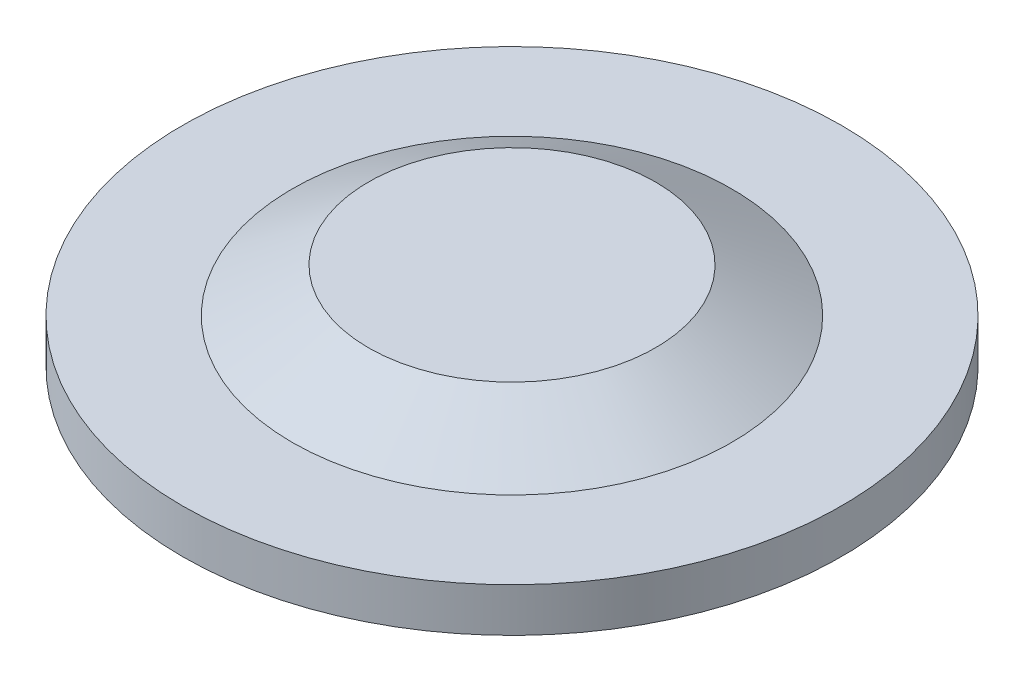
ISO-10303-21;
HEADER;
FILE_DESCRIPTION(('STEP AP214'),'2;1');
FILE_NAME('part.step','',(''),(''),'','','');
FILE_SCHEMA(('AUTOMOTIVE_DESIGN { 1 0 10303 214 1 1 1 1 }'));
ENDSEC;
DATA;
#1=APPLICATION_CONTEXT('core data for automotive mechanical design processes');
#2=APPLICATION_PROTOCOL_DEFINITION('international standard','automotive_design',2000,#1);
#3=PRODUCT_CONTEXT('',#1,'mechanical');
#4=PRODUCT('Part','Part','',(#3));
#5=PRODUCT_RELATED_PRODUCT_CATEGORY('part','',(#4));
#6=PRODUCT_DEFINITION_FORMATION('','',#4);
#7=PRODUCT_DEFINITION_CONTEXT('part definition',#1,'design');
#8=PRODUCT_DEFINITION('design','',#6,#7);
#9=PRODUCT_DEFINITION_SHAPE('','',#8);
#10=(LENGTH_UNIT() NAMED_UNIT(*) SI_UNIT(.MILLI.,.METRE.));
#11=(NAMED_UNIT(*) PLANE_ANGLE_UNIT() SI_UNIT($,.RADIAN.));
#12=(NAMED_UNIT(*) SI_UNIT($,.STERADIAN.) SOLID_ANGLE_UNIT());
#13=UNCERTAINTY_MEASURE_WITH_UNIT(LENGTH_MEASURE(1.E-05),#10,'distance_accuracy_value','');
#14=(GEOMETRIC_REPRESENTATION_CONTEXT(3) GLOBAL_UNCERTAINTY_ASSIGNED_CONTEXT((#13)) GLOBAL_UNIT_ASSIGNED_CONTEXT((#10,
#11,#12)) REPRESENTATION_CONTEXT('',''));
#15=CARTESIAN_POINT('',(0.,0.,0.));
#16=DIRECTION('',(0.,0.,1.));
#17=DIRECTION('',(1.,0.,0.));
#18=AXIS2_PLACEMENT_3D('',#15,#16,#17);
#19=CARTESIAN_POINT('',(0.,0.762,0.));
#20=DIRECTION('',(0.,-1.,0.));
#21=DIRECTION('',(0.,0.,-1.));
#22=AXIS2_PLACEMENT_3D('',#19,#20,#21);
#23=CYLINDRICAL_SURFACE('',#22,5.715);
#24=CARTESIAN_POINT('',(0.,0.762,0.));
#25=DIRECTION('',(0.,1.,0.));
#26=DIRECTION('',(0.,0.,1.));
#27=AXIS2_PLACEMENT_3D('',#24,#25,#26);
#28=CIRCLE('',#27,5.715);
#29=CARTESIAN_POINT('',(0.,0.762,-5.715));
#30=VERTEX_POINT('',#29);
#31=EDGE_CURVE('E51',#30,#30,#28,.T.);
#32=CARTESIAN_POINT('',(0.,0.,0.));
#33=DIRECTION('',(0.,1.,0.));
#34=DIRECTION('',(0.,0.,1.));
#35=AXIS2_PLACEMENT_3D('',#32,#33,#34);
#36=CIRCLE('',#35,5.715);
#37=CARTESIAN_POINT('',(0.,0.,-5.715));
#38=VERTEX_POINT('',#37);
#39=EDGE_CURVE('E46',#38,#38,#36,.T.);
#40=CARTESIAN_POINT('',(0.,0.762,-5.715));
#41=CARTESIAN_POINT('',(0.,0.7540625,-5.715));
#42=CARTESIAN_POINT('',(0.,0.746125,-5.715));
#43=CARTESIAN_POINT('',(0.,0.73025,-5.715));
#44=CARTESIAN_POINT('',(0.,0.7223125,-5.715));
#45=CARTESIAN_POINT('',(0.,0.7064375,-5.715));
#46=CARTESIAN_POINT('',(0.,0.6985,-5.715));
#47=CARTESIAN_POINT('',(0.,0.682625,-5.715));
#48=CARTESIAN_POINT('',(0.,0.6746875,-5.715));
#49=CARTESIAN_POINT('',(0.,0.6588125,-5.715));
#50=CARTESIAN_POINT('',(0.,0.650875,-5.715));
#51=CARTESIAN_POINT('',(0.,0.635,-5.715));
#52=CARTESIAN_POINT('',(0.,0.6270625,-5.715));
#53=CARTESIAN_POINT('',(0.,0.6111875,-5.715));
#54=CARTESIAN_POINT('',(0.,0.60325,-5.715));
#55=CARTESIAN_POINT('',(0.,0.587375,-5.715));
#56=CARTESIAN_POINT('',(0.,0.5794375,-5.715));
#57=CARTESIAN_POINT('',(0.,0.5635625,-5.715));
#58=CARTESIAN_POINT('',(0.,0.555625,-5.715));
#59=CARTESIAN_POINT('',(0.,0.53975,-5.715));
#60=CARTESIAN_POINT('',(0.,0.5318125,-5.715));
#61=CARTESIAN_POINT('',(0.,0.5159375,-5.715));
#62=CARTESIAN_POINT('',(0.,0.508,-5.715));
#63=CARTESIAN_POINT('',(0.,0.492125,-5.715));
#64=CARTESIAN_POINT('',(0.,0.4841875,-5.715));
#65=CARTESIAN_POINT('',(0.,0.4683125,-5.715));
#66=CARTESIAN_POINT('',(0.,0.460375,-5.715));
#67=CARTESIAN_POINT('',(0.,0.4445,-5.715));
#68=CARTESIAN_POINT('',(0.,0.4365625,-5.715));
#69=CARTESIAN_POINT('',(0.,0.4206875,-5.715));
#70=CARTESIAN_POINT('',(0.,0.41275,-5.715));
#71=CARTESIAN_POINT('',(0.,0.396875,-5.715));
#72=CARTESIAN_POINT('',(0.,0.3889375,-5.715));
#73=CARTESIAN_POINT('',(0.,0.3730625,-5.715));
#74=CARTESIAN_POINT('',(0.,0.365125,-5.715));
#75=CARTESIAN_POINT('',(0.,0.34925,-5.715));
#76=CARTESIAN_POINT('',(0.,0.3413125,-5.715));
#77=CARTESIAN_POINT('',(0.,0.3254375,-5.715));
#78=CARTESIAN_POINT('',(0.,0.3175,-5.715));
#79=CARTESIAN_POINT('',(0.,0.301625,-5.715));
#80=CARTESIAN_POINT('',(0.,0.2936875,-5.715));
#81=CARTESIAN_POINT('',(0.,0.2778125,-5.715));
#82=CARTESIAN_POINT('',(0.,0.269875,-5.715));
#83=CARTESIAN_POINT('',(0.,0.254,-5.715));
#84=CARTESIAN_POINT('',(0.,0.2460625,-5.715));
#85=CARTESIAN_POINT('',(0.,0.2301875,-5.715));
#86=CARTESIAN_POINT('',(0.,0.22225,-5.715));
#87=CARTESIAN_POINT('',(0.,0.206375,-5.715));
#88=CARTESIAN_POINT('',(0.,0.1984375,-5.715));
#89=CARTESIAN_POINT('',(0.,0.1825625,-5.715));
#90=CARTESIAN_POINT('',(0.,0.174625,-5.715));
#91=CARTESIAN_POINT('',(0.,0.15875,-5.715));
#92=CARTESIAN_POINT('',(0.,0.1508125,-5.715));
#93=CARTESIAN_POINT('',(0.,0.1349375,-5.715));
#94=CARTESIAN_POINT('',(0.,0.127,-5.715));
#95=CARTESIAN_POINT('',(0.,0.111125,-5.715));
#96=CARTESIAN_POINT('',(0.,0.1031875,-5.715));
#97=CARTESIAN_POINT('',(0.,0.0873125,-5.715));
#98=CARTESIAN_POINT('',(0.,0.079375,-5.715));
#99=CARTESIAN_POINT('',(0.,0.0635,-5.715));
#100=CARTESIAN_POINT('',(0.,0.0555625,-5.715));
#101=CARTESIAN_POINT('',(0.,0.0396875,-5.715));
#102=CARTESIAN_POINT('',(0.,0.03175,-5.715));
#103=CARTESIAN_POINT('',(0.,0.015875,-5.715));
#104=CARTESIAN_POINT('',(0.,0.00793749999999999,-5.715));
#105=CARTESIAN_POINT('',(0.,0.,-5.715));
#106=B_SPLINE_CURVE_WITH_KNOTS('',3,(#40,#41,#42,#43,#44,#45,#46,#47,#48,#49,#50,#51,#52,#53,
#54,#55,#56,#57,#58,#59,#60,#61,#62,#63,#64,#65,#66,#67,#68,#69,#70,#71,#72,#73,#74,#75,#76,#77,
#78,#79,#80,#81,#82,#83,#84,#85,#86,#87,#88,#89,#90,#91,#92,#93,#94,#95,#96,#97,#98,#99,#100,
#101,#102,#103,#104,#105),.UNSPECIFIED.,.F.,.F.,(4,2,2,2,2,2,2,2,2,2,2,2,2,2,2,2,2,2,2,2,2,2,2,
2,2,2,2,2,2,2,2,2,4),(0.,0.0238125,0.0476249999999999,0.0714374999999999,0.09525,0.1190625,
0.142875,0.1666875,0.1905,0.2143125,0.238125,0.2619375,0.28575,0.3095625,0.333375,0.3571875,
0.381,0.4048125,0.428625,0.4524375,0.47625,0.5000625,0.523875,0.5476875,0.5715,0.5953125,
0.619125,0.6429375,0.66675,0.6905625,0.714375,0.7381875,0.762),.UNSPECIFIED.);
#107=EDGE_CURVE('BSEAM43',#30,#38,#106,.T.);
#108=ORIENTED_EDGE('',*,*,#31,.F.);
#109=ORIENTED_EDGE('',*,*,#39,.T.);
#110=ORIENTED_EDGE('',*,*,#107,.T.);
#111=ORIENTED_EDGE('',*,*,#107,.F.);
#112=EDGE_LOOP('',(#108,#110,#109,#111));
#113=FACE_BOUND('',#112,.T.);
#114=ADVANCED_FACE('F43',(#113),#23,.T.);
#115=CARTESIAN_POINT('',(0.,0.762,0.));
#116=DIRECTION('',(0.,1.,0.));
#117=DIRECTION('',(0.,0.,1.));
#118=AXIS2_PLACEMENT_3D('',#115,#116,#117);
#119=PLANE('',#118);
#120=CARTESIAN_POINT('',(0.,0.762,0.));
#121=DIRECTION('',(0.,1.,0.));
#122=DIRECTION('',(0.,0.,1.));
#123=AXIS2_PLACEMENT_3D('',#120,#121,#122);
#124=CIRCLE('',#123,3.81);
#125=CARTESIAN_POINT('',(0.,0.762,3.81));
#126=VERTEX_POINT('',#125);
#127=EDGE_CURVE('E10',#126,#126,#124,.T.);
#128=ORIENTED_EDGE('',*,*,#127,.F.);
#129=EDGE_LOOP('',(#128));
#130=FACE_BOUND('',#129,.T.);
#131=ORIENTED_EDGE('',*,*,#31,.T.);
#132=EDGE_LOOP('',(#131));
#133=FACE_BOUND('',#132,.T.);
#134=ADVANCED_FACE('F71',(#130,#133),#119,.T.);
#135=CARTESIAN_POINT('',(0.,0.,0.));
#136=DIRECTION('',(0.,1.,0.));
#137=DIRECTION('',(0.,0.,1.));
#138=AXIS2_PLACEMENT_3D('',#135,#136,#137);
#139=PLANE('',#138);
#140=ORIENTED_EDGE('',*,*,#39,.F.);
#141=EDGE_LOOP('',(#140));
#142=FACE_BOUND('',#141,.T.);
#143=ADVANCED_FACE('F68',(#142),#139,.F.);
#144=CARTESIAN_POINT('',(0.,0.762,0.));
#145=DIRECTION('',(0.,-1.,0.));
#146=DIRECTION('',(0.,0.,1.));
#147=AXIS2_PLACEMENT_3D('',#144,#145,#146);
#148=CONICAL_SURFACE('',#147,3.81,1.0471975511966);
#149=CARTESIAN_POINT('',(0.,1.524,0.));
#150=DIRECTION('',(0.,1.,0.));
#151=DIRECTION('',(0.,0.,1.));
#152=AXIS2_PLACEMENT_3D('',#149,#150,#151);
#153=CIRCLE('',#152,2.49017728463251);
#154=CARTESIAN_POINT('',(0.,1.524,2.49017728463251));
#155=VERTEX_POINT('',#154);
#156=EDGE_CURVE('E58',#155,#155,#153,.T.);
#157=ORIENTED_EDGE('',*,*,#156,.F.);
#158=EDGE_LOOP('',(#157));
#159=FACE_BOUND('',#158,.T.);
#160=ORIENTED_EDGE('',*,*,#127,.T.);
#161=EDGE_LOOP('',(#160));
#162=FACE_BOUND('',#161,.T.);
#163=ADVANCED_FACE('F70',(#159,#162),#148,.T.);
#164=CARTESIAN_POINT('',(0.,1.524,0.));
#165=DIRECTION('',(0.,1.,0.));
#166=DIRECTION('',(0.,0.,1.));
#167=AXIS2_PLACEMENT_3D('',#164,#165,#166);
#168=PLANE('',#167);
#169=ORIENTED_EDGE('',*,*,#156,.T.);
#170=EDGE_LOOP('',(#169));
#171=FACE_BOUND('',#170,.T.);
#172=ADVANCED_FACE('F77',(#171),#168,.T.);
#173=CLOSED_SHELL('',(#114,#134,#143,#163,#172));
#174=MANIFOLD_SOLID_BREP('B2',#173);
#175=ADVANCED_BREP_SHAPE_REPRESENTATION('',(#18,#174),#14);
#176=SHAPE_DEFINITION_REPRESENTATION(#9,#175);
ENDSEC;
END-ISO-10303-21;
